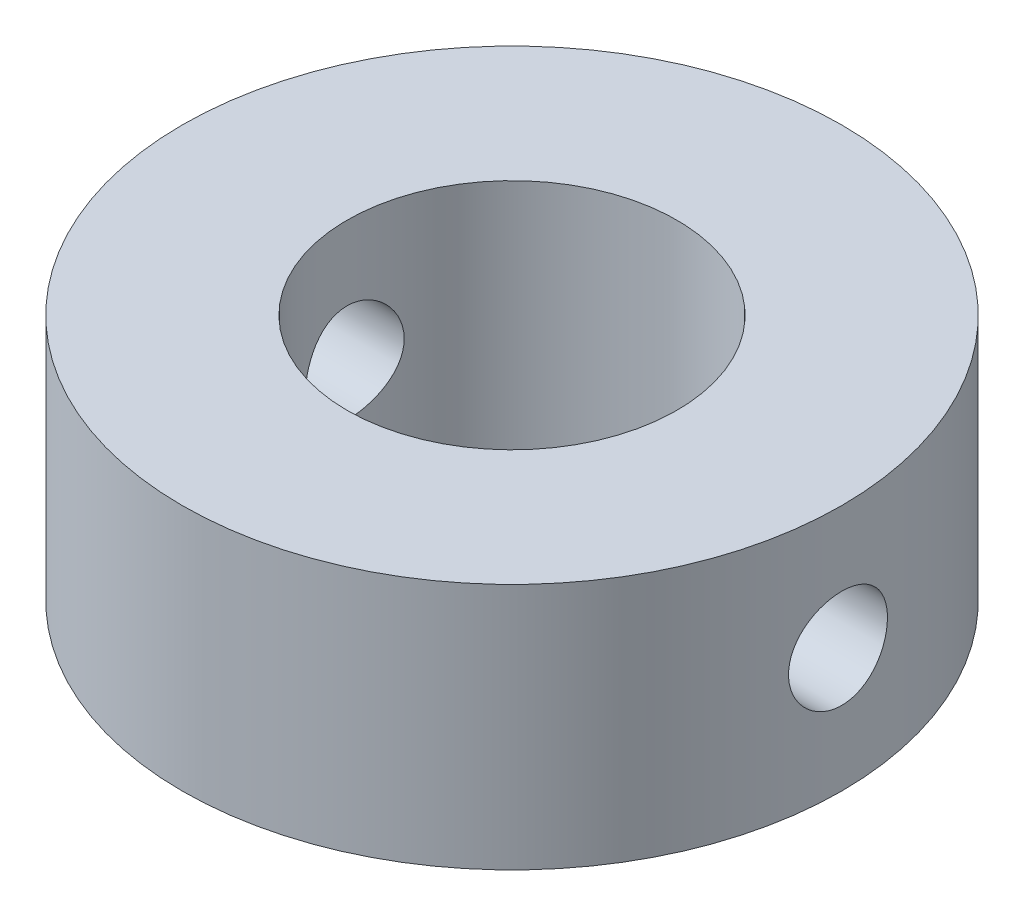
ISO-10303-21;
HEADER;
FILE_DESCRIPTION(('STEP AP214'),'2;1');
FILE_NAME('part.step','',(''),(''),'','','');
FILE_SCHEMA(('AUTOMOTIVE_DESIGN { 1 0 10303 214 1 1 1 1 }'));
ENDSEC;
DATA;
#1=APPLICATION_CONTEXT('core data for automotive mechanical design processes');
#2=APPLICATION_PROTOCOL_DEFINITION('international standard','automotive_design',2000,#1);
#3=PRODUCT_CONTEXT('',#1,'mechanical');
#4=PRODUCT('Part','Part','',(#3));
#5=PRODUCT_RELATED_PRODUCT_CATEGORY('part','',(#4));
#6=PRODUCT_DEFINITION_FORMATION('','',#4);
#7=PRODUCT_DEFINITION_CONTEXT('part definition',#1,'design');
#8=PRODUCT_DEFINITION('design','',#6,#7);
#9=PRODUCT_DEFINITION_SHAPE('','',#8);
#10=(LENGTH_UNIT() NAMED_UNIT(*) SI_UNIT(.MILLI.,.METRE.));
#11=(NAMED_UNIT(*) PLANE_ANGLE_UNIT() SI_UNIT($,.RADIAN.));
#12=(NAMED_UNIT(*) SI_UNIT($,.STERADIAN.) SOLID_ANGLE_UNIT());
#13=UNCERTAINTY_MEASURE_WITH_UNIT(LENGTH_MEASURE(1.E-05),#10,'distance_accuracy_value','');
#14=(GEOMETRIC_REPRESENTATION_CONTEXT(3) GLOBAL_UNCERTAINTY_ASSIGNED_CONTEXT((#13)) GLOBAL_UNIT_ASSIGNED_CONTEXT((#10,
#11,#12)) REPRESENTATION_CONTEXT('',''));
#15=CARTESIAN_POINT('',(0.,0.,0.));
#16=DIRECTION('',(0.,0.,1.));
#17=DIRECTION('',(1.,0.,0.));
#18=AXIS2_PLACEMENT_3D('',#15,#16,#17);
#19=CARTESIAN_POINT('',(0.,7.5,0.));
#20=DIRECTION('',(0.,1.,0.));
#21=DIRECTION('',(0.,0.,1.));
#22=AXIS2_PLACEMENT_3D('',#19,#20,#21);
#23=PLANE('',#22);
#24=CARTESIAN_POINT('',(0.,7.5,0.));
#25=DIRECTION('',(0.,1.,0.));
#26=DIRECTION('',(0.,0.,1.));
#27=AXIS2_PLACEMENT_3D('',#24,#25,#26);
#28=CIRCLE('',#27,10.);
#29=CARTESIAN_POINT('',(0.,7.5,10.));
#30=VERTEX_POINT('',#29);
#31=EDGE_CURVE('E10',#30,#30,#28,.T.);
#32=ORIENTED_EDGE('',*,*,#31,.T.);
#33=EDGE_LOOP('',(#32));
#34=FACE_BOUND('',#33,.T.);
#35=CARTESIAN_POINT('',(0.,7.5,0.));
#36=DIRECTION('',(0.,1.,0.));
#37=DIRECTION('',(0.,0.,1.));
#38=AXIS2_PLACEMENT_3D('',#35,#36,#37);
#39=CIRCLE('',#38,5.);
#40=CARTESIAN_POINT('',(0.,7.5,5.));
#41=VERTEX_POINT('',#40);
#42=EDGE_CURVE('E48',#41,#41,#39,.T.);
#43=ORIENTED_EDGE('',*,*,#42,.F.);
#44=EDGE_LOOP('',(#43));
#45=FACE_BOUND('',#44,.T.);
#46=ADVANCED_FACE('F30',(#34,#45),#23,.T.);
#47=CARTESIAN_POINT('',(0.,0.,0.));
#48=DIRECTION('',(0.,1.,0.));
#49=DIRECTION('',(0.,0.,1.));
#50=AXIS2_PLACEMENT_3D('',#47,#48,#49);
#51=PLANE('',#50);
#52=CARTESIAN_POINT('',(0.,0.,0.));
#53=DIRECTION('',(0.,1.,0.));
#54=DIRECTION('',(0.,0.,1.));
#55=AXIS2_PLACEMENT_3D('',#52,#53,#54);
#56=CIRCLE('',#55,10.);
#57=CARTESIAN_POINT('',(0.,0.,10.));
#58=VERTEX_POINT('',#57);
#59=EDGE_CURVE('E43',#58,#58,#56,.T.);
#60=ORIENTED_EDGE('',*,*,#59,.F.);
#61=EDGE_LOOP('',(#60));
#62=FACE_BOUND('',#61,.T.);
#63=CARTESIAN_POINT('',(0.,0.,0.));
#64=DIRECTION('',(0.,1.,0.));
#65=DIRECTION('',(0.,0.,1.));
#66=AXIS2_PLACEMENT_3D('',#63,#64,#65);
#67=CIRCLE('',#66,5.);
#68=CARTESIAN_POINT('',(0.,0.,5.));
#69=VERTEX_POINT('',#68);
#70=EDGE_CURVE('E51',#69,#69,#67,.T.);
#71=ORIENTED_EDGE('',*,*,#70,.T.);
#72=EDGE_LOOP('',(#71));
#73=FACE_BOUND('',#72,.T.);
#74=ADVANCED_FACE('F84',(#62,#73),#51,.F.);
#75=CARTESIAN_POINT('',(0.,7.5,0.));
#76=DIRECTION('',(0.,-1.,0.));
#77=DIRECTION('',(0.,0.,-1.));
#78=AXIS2_PLACEMENT_3D('',#75,#76,#77);
#79=CYLINDRICAL_SURFACE('',#78,10.);
#80=CARTESIAN_POINT('',(-9.88685996664259,3.75,-1.5));
#81=CARTESIAN_POINT('',(-9.88686136668593,3.83374556928995,-1.49999654107284));
#82=CARTESIAN_POINT('',(-9.88793551739101,3.91753975075071,-1.49296296388491));
#83=CARTESIAN_POINT('',(-9.8921131480324,4.08278531488313,-1.46502196657001));
#84=CARTESIAN_POINT('',(-9.8952186073143,4.16423433148001,-1.44410101402628));
#85=CARTESIAN_POINT('',(-9.90309938986228,4.3223737554469,-1.38902526098084));
#86=CARTESIAN_POINT('',(-9.90787343131536,4.39906776254216,-1.35488061681397));
#87=CARTESIAN_POINT('',(-9.91855194113145,4.54562703077208,-1.27435063087791));
#88=CARTESIAN_POINT('',(-9.92445625383668,4.6154932302143,-1.22796697429872));
#89=CARTESIAN_POINT('',(-9.9367828924804,4.74698381675433,-1.12387902418558));
#90=CARTESIAN_POINT('',(-9.94320862458057,4.80854561340674,-1.0660960558482));
#91=CARTESIAN_POINT('',(-9.95582368169047,4.9211374856555,-0.941019605444374));
#92=CARTESIAN_POINT('',(-9.96201299368615,4.97216698216699,-0.873725600786529));
#93=CARTESIAN_POINT('',(-9.97349347428185,5.06247663169136,-0.731136358052745));
#94=CARTESIAN_POINT('',(-9.97878018435569,5.10169915032246,-0.655804227365766));
#95=CARTESIAN_POINT('',(-9.98782206746405,5.16691159880818,-0.499528850106974));
#96=CARTESIAN_POINT('',(-9.99157732141945,5.19290222784289,-0.418585900270677));
#97=CARTESIAN_POINT('',(-9.99710914797782,5.23072338853084,-0.254031123090569));
#98=CARTESIAN_POINT('',(-9.99890035887344,5.24265872638717,-0.170443884389866));
#99=CARTESIAN_POINT('',(-10.0003524476958,5.2523559348249,-0.0024352040194791));
#100=CARTESIAN_POINT('',(-10.0000134440494,5.25011859331969,0.0819861910157462));
#101=CARTESIAN_POINT('',(-9.99725499660796,5.23161666223757,0.24855171820052));
#102=CARTESIAN_POINT('',(-9.99485227652479,5.21546482820852,0.330708691400008));
#103=CARTESIAN_POINT('',(-9.98825500227851,5.16976939367743,0.491132829143138));
#104=CARTESIAN_POINT('',(-9.98406040199739,5.14022544849856,0.569399893513481));
#105=CARTESIAN_POINT('',(-9.97432193873206,5.06846900308291,0.720163780770317));
#106=CARTESIAN_POINT('',(-9.96877303515638,5.02620903489126,0.792637672323597));
#107=CARTESIAN_POINT('',(-9.95694438245421,4.93025480633001,0.929507907150178));
#108=CARTESIAN_POINT('',(-9.95066458523184,4.87655979329313,0.993903718271736));
#109=CARTESIAN_POINT('',(-9.93800158192627,4.75863155117341,1.11345448272265));
#110=CARTESIAN_POINT('',(-9.93161796623257,4.69429987802989,1.16851232950947));
#111=CARTESIAN_POINT('',(-9.91952704453523,4.55725892287627,1.26706599338813));
#112=CARTESIAN_POINT('',(-9.91381974269649,4.48454958928008,1.31056173927999));
#113=CARTESIAN_POINT('',(-9.90372775286855,4.33271603705936,1.38476964534605));
#114=CARTESIAN_POINT('',(-9.89934409845291,4.25358686633761,1.41547182270082));
#115=CARTESIAN_POINT('',(-9.89241402899059,4.09121474485261,1.46312336208879));
#116=CARTESIAN_POINT('',(-9.88986748446299,4.00797208445325,1.48007369337326));
#117=CARTESIAN_POINT('',(-9.88692451395027,3.84059991042251,1.49960720086655));
#118=CARTESIAN_POINT('',(-9.88650748802574,3.75648681179847,1.50232803265052));
#119=CARTESIAN_POINT('',(-9.88781607937153,3.58900580518266,1.49369057019819));
#120=CARTESIAN_POINT('',(-9.88954163015778,3.50563787414924,1.48233271282302));
#121=CARTESIAN_POINT('',(-9.89492202461453,3.34244018203437,1.44597702952766));
#122=CARTESIAN_POINT('',(-9.89856716482858,3.2625947950584,1.42104778527821));
#123=CARTESIAN_POINT('',(-9.90736801825768,3.10821590795139,1.35832831947087));
#124=CARTESIAN_POINT('',(-9.91252380607176,3.0336826703718,1.32053746276389));
#125=CARTESIAN_POINT('',(-9.92381355687063,2.89142673966496,1.23283677995324));
#126=CARTESIAN_POINT('',(-9.92995459279988,2.82375955272018,1.18283784561766));
#127=CARTESIAN_POINT('',(-9.94250159433355,2.69772714012619,1.07226416837201));
#128=CARTESIAN_POINT('',(-9.94890757490292,2.63936244081885,1.0116888274468));
#129=CARTESIAN_POINT('',(-9.96132705217386,2.53309739336642,0.881075619628184));
#130=CARTESIAN_POINT('',(-9.96733683460423,2.48528827175752,0.810963126771957));
#131=CARTESIAN_POINT('',(-9.97822905032016,2.40212709473736,0.663622080263681));
#132=CARTESIAN_POINT('',(-9.98311151444563,2.36677469853497,0.586393721360439));
#133=CARTESIAN_POINT('',(-9.99118269660795,2.30967625751197,0.427297995861147));
#134=CARTESIAN_POINT('',(-9.99437761717899,2.28788033292164,0.345448858754302));
#135=CARTESIAN_POINT('',(-9.99873976656896,2.25835212046253,0.179200815501193));
#136=CARTESIAN_POINT('',(-9.99990712930801,2.25061890375086,0.0948020781305811));
#137=CARTESIAN_POINT('',(-10.0000812905914,2.2494582954506,-0.0732645908608183));
#138=CARTESIAN_POINT('',(-9.99910917023796,2.25589131912302,-0.156931570212052));
#139=CARTESIAN_POINT('',(-9.99515610519141,2.28258138842076,-0.321979795323107));
#140=CARTESIAN_POINT('',(-9.99217516692666,2.30283838980856,-0.403361048396512));
#141=CARTESIAN_POINT('',(-9.98453786742463,2.35655187557024,-0.561489374379661));
#142=CARTESIAN_POINT('',(-9.97988273316947,2.38999869513893,-0.638239793148783));
#143=CARTESIAN_POINT('',(-9.96940834495499,2.46912748798314,-0.785061117896603));
#144=CARTESIAN_POINT('',(-9.96358905320338,2.51480985848034,-0.855131806920709));
#145=CARTESIAN_POINT('',(-9.95136510636178,2.61761769882917,-0.987312585191959));
#146=CARTESIAN_POINT('',(-9.94495548425942,2.67484622581634,-1.04934206644638));
#147=CARTESIAN_POINT('',(-9.93231001689001,2.79890507308047,-1.16296808390268));
#148=CARTESIAN_POINT('',(-9.92607421276291,2.86573764382435,-1.21456216798984));
#149=CARTESIAN_POINT('',(-9.91444484029116,3.00754898323253,-1.30611310822974));
#150=CARTESIAN_POINT('',(-9.90905620156985,3.08257141702183,-1.34600294291209));
#151=CARTESIAN_POINT('',(-9.89978909110724,3.2382967767633,-1.41255613872045));
#152=CARTESIAN_POINT('',(-9.89590905307931,3.31899370785782,-1.43923322574898));
#153=CARTESIAN_POINT('',(-9.89099485524825,3.45837743625648,-1.47254951890026));
#154=CARTESIAN_POINT('',(-9.88945249382379,3.51620339692427,-1.4828276978042));
#155=CARTESIAN_POINT('',(-9.88738456567011,3.63267829173435,-1.49655410576574));
#156=CARTESIAN_POINT('',(-9.88685898576155,3.69132721519961,-1.50000242335076));
#157=CARTESIAN_POINT('',(-9.88685996664259,3.75,-1.5));
#158=B_SPLINE_CURVE_WITH_KNOTS('',3,(#80,#81,#82,#83,#84,#85,#86,#87,#88,#89,#90,#91,#92,#93,
#94,#95,#96,#97,#98,#99,#100,#101,#102,#103,#104,#105,#106,#107,#108,#109,#110,#111,#112,#113,
#114,#115,#116,#117,#118,#119,#120,#121,#122,#123,#124,#125,#126,#127,#128,#129,#130,#131,#132,
#133,#134,#135,#136,#137,#138,#139,#140,#141,#142,#143,#144,#145,#146,#147,#148,#149,#150,#151,
#152,#153,#154,#155,#156,#157),.UNSPECIFIED.,.T.,.F.,(4,2,2,2,2,2,2,2,2,2,2,2,2,2,2,2,2,2,2,2,2,
2,2,2,2,2,2,2,2,2,2,2,2,2,2,2,2,2,4),(0.,0.251022251804868,0.502289469561802,0.753364085335675,
1.00440414866133,1.25724158649107,1.51009292207817,1.76415922105782,2.01821209364501,
2.27035832534397,2.52249053939374,2.77259862515728,3.02271314839401,3.27377316386454,
3.52484970949272,3.77839544666269,4.0319427451435,4.28568751773139,4.53941440444341,
4.79068214603744,5.04194209099918,5.29194394807374,5.54195815286117,5.79385486001302,
6.04576581461802,6.29977537753516,6.55377799071854,6.8068404089109,7.05988611170473,
7.31044963622327,7.56101235892823,7.81139182257833,8.06177941567107,8.31450950010969,
8.56729890236862,8.82150878824931,9.07545403445564,9.25132441891613,9.42719252376192),.UNSPECIFIED.);
#159=CARTESIAN_POINT('',(-9.88685996664259,3.75,-1.5));
#160=VERTEX_POINT('',#159);
#161=EDGE_CURVE('E74',#160,#160,#158,.T.);
#162=ORIENTED_EDGE('',*,*,#161,.T.);
#163=EDGE_LOOP('',(#162));
#164=FACE_BOUND('',#163,.T.);
#165=CARTESIAN_POINT('',(9.88685996664259,3.75,-1.5));
#166=CARTESIAN_POINT('',(9.88686136668593,3.66625443071005,-1.49999654107284));
#167=CARTESIAN_POINT('',(9.88793551739101,3.58246024924929,-1.49296296388491));
#168=CARTESIAN_POINT('',(9.8921131480324,3.41721468511687,-1.46502196657001));
#169=CARTESIAN_POINT('',(9.8952186073143,3.33576566851999,-1.44410101402628));
#170=CARTESIAN_POINT('',(9.90309938986228,3.1776262445531,-1.38902526098084));
#171=CARTESIAN_POINT('',(9.90787343131536,3.10093223745784,-1.35488061681397));
#172=CARTESIAN_POINT('',(9.91855194113145,2.95437296922792,-1.27435063087791));
#173=CARTESIAN_POINT('',(9.92445625383668,2.8845067697857,-1.22796697429872));
#174=CARTESIAN_POINT('',(9.9367828924804,2.75301618324567,-1.12387902418558));
#175=CARTESIAN_POINT('',(9.94320862458057,2.69145438659326,-1.0660960558482));
#176=CARTESIAN_POINT('',(9.95582368169047,2.5788625143445,-0.941019605444374));
#177=CARTESIAN_POINT('',(9.96201299368615,2.52783301783301,-0.87372560078653));
#178=CARTESIAN_POINT('',(9.97349347428185,2.43752336830864,-0.731136358052746));
#179=CARTESIAN_POINT('',(9.97878018435569,2.39830084967754,-0.655804227365768));
#180=CARTESIAN_POINT('',(9.98782206746405,2.33308840119182,-0.499528850106975));
#181=CARTESIAN_POINT('',(9.99157732141945,2.30709777215711,-0.418585900270678));
#182=CARTESIAN_POINT('',(9.99710914797782,2.26927661146916,-0.25403112309057));
#183=CARTESIAN_POINT('',(9.99890035887344,2.25734127361284,-0.170443884389867));
#184=CARTESIAN_POINT('',(10.0003524476958,2.2476440651751,-0.0024352040194794));
#185=CARTESIAN_POINT('',(10.0000134440494,2.24988140668031,0.0819861910157459));
#186=CARTESIAN_POINT('',(9.99725499660796,2.26838333776243,0.248551718200519));
#187=CARTESIAN_POINT('',(9.99485227652479,2.28453517179148,0.330708691400007));
#188=CARTESIAN_POINT('',(9.98825500227851,2.33023060632257,0.491132829143137));
#189=CARTESIAN_POINT('',(9.98406040199739,2.35977455150144,0.569399893513481));
#190=CARTESIAN_POINT('',(9.97432193873206,2.43153099691709,0.720163780770316));
#191=CARTESIAN_POINT('',(9.96877303515638,2.47379096510874,0.792637672323596));
#192=CARTESIAN_POINT('',(9.95694438245421,2.56974519366999,0.929507907150177));
#193=CARTESIAN_POINT('',(9.95066458523184,2.62344020670686,0.993903718271735));
#194=CARTESIAN_POINT('',(9.93800158192627,2.74136844882659,1.11345448272265));
#195=CARTESIAN_POINT('',(9.93161796623257,2.80570012197011,1.16851232950947));
#196=CARTESIAN_POINT('',(9.91952704453523,2.94274107712373,1.26706599338813));
#197=CARTESIAN_POINT('',(9.91381974269649,3.01545041071992,1.31056173927999));
#198=CARTESIAN_POINT('',(9.90372775286855,3.16728396294064,1.38476964534605));
#199=CARTESIAN_POINT('',(9.89934409845291,3.24641313366239,1.41547182270082));
#200=CARTESIAN_POINT('',(9.89241402899059,3.40878525514739,1.46312336208879));
#201=CARTESIAN_POINT('',(9.88986748446299,3.49202791554675,1.48007369337326));
#202=CARTESIAN_POINT('',(9.88692451395027,3.65940008957749,1.49960720086655));
#203=CARTESIAN_POINT('',(9.88650748802574,3.74351318820153,1.50232803265052));
#204=CARTESIAN_POINT('',(9.88781607937153,3.91099419481734,1.49369057019819));
#205=CARTESIAN_POINT('',(9.88954163015778,3.99436212585076,1.48233271282302));
#206=CARTESIAN_POINT('',(9.89492202461453,4.15755981796563,1.44597702952766));
#207=CARTESIAN_POINT('',(9.89856716482858,4.2374052049416,1.42104778527821));
#208=CARTESIAN_POINT('',(9.90736801825768,4.39178409204861,1.35832831947087));
#209=CARTESIAN_POINT('',(9.91252380607176,4.4663173296282,1.32053746276389));
#210=CARTESIAN_POINT('',(9.92381355687063,4.60857326033504,1.23283677995324));
#211=CARTESIAN_POINT('',(9.92995459279988,4.67624044727982,1.18283784561766));
#212=CARTESIAN_POINT('',(9.94250159433355,4.80227285987381,1.07226416837201));
#213=CARTESIAN_POINT('',(9.94890757490292,4.86063755918115,1.0116888274468));
#214=CARTESIAN_POINT('',(9.96132705217386,4.96690260663358,0.881075619628184));
#215=CARTESIAN_POINT('',(9.96733683460423,5.01471172824248,0.810963126771958));
#216=CARTESIAN_POINT('',(9.97822905032016,5.09787290526264,0.663622080263682));
#217=CARTESIAN_POINT('',(9.98311151444563,5.13322530146503,0.586393721360439));
#218=CARTESIAN_POINT('',(9.99118269660795,5.19032374248803,0.427297995861147));
#219=CARTESIAN_POINT('',(9.99437761717899,5.21211966707836,0.345448858754303));
#220=CARTESIAN_POINT('',(9.99873976656896,5.24164787953747,0.179200815501194));
#221=CARTESIAN_POINT('',(9.99990712930801,5.24938109624914,0.0948020781305815));
#222=CARTESIAN_POINT('',(10.0000812905914,5.2505417045494,-0.0732645908608177));
#223=CARTESIAN_POINT('',(9.99910917023796,5.24410868087698,-0.156931570212051));
#224=CARTESIAN_POINT('',(9.99515610519141,5.21741861157924,-0.321979795323106));
#225=CARTESIAN_POINT('',(9.99217516692666,5.19716161019144,-0.403361048396512));
#226=CARTESIAN_POINT('',(9.98453786742463,5.14344812442976,-0.561489374379661));
#227=CARTESIAN_POINT('',(9.97988273316947,5.11000130486107,-0.638239793148782));
#228=CARTESIAN_POINT('',(9.96940834495499,5.03087251201686,-0.785061117896602));
#229=CARTESIAN_POINT('',(9.96358905320338,4.98519014151966,-0.855131806920709));
#230=CARTESIAN_POINT('',(9.95136510636178,4.88238230117083,-0.987312585191959));
#231=CARTESIAN_POINT('',(9.94495548425942,4.82515377418366,-1.04934206644638));
#232=CARTESIAN_POINT('',(9.93231001689001,4.70109492691953,-1.16296808390268));
#233=CARTESIAN_POINT('',(9.92607421276291,4.63426235617565,-1.21456216798984));
#234=CARTESIAN_POINT('',(9.91444484029116,4.49245101676747,-1.30611310822974));
#235=CARTESIAN_POINT('',(9.90905620156985,4.41742858297817,-1.34600294291209));
#236=CARTESIAN_POINT('',(9.89978909110724,4.2617032232367,-1.41255613872045));
#237=CARTESIAN_POINT('',(9.89590905307931,4.18100629214218,-1.43923322574898));
#238=CARTESIAN_POINT('',(9.89099485524825,4.04162256374352,-1.47254951890026));
#239=CARTESIAN_POINT('',(9.88945249382379,3.98379660307573,-1.4828276978042));
#240=CARTESIAN_POINT('',(9.88738456567011,3.86732170826565,-1.49655410576574));
#241=CARTESIAN_POINT('',(9.88685898576155,3.80867278480039,-1.50000242335076));
#242=CARTESIAN_POINT('',(9.88685996664259,3.75,-1.5));
#243=B_SPLINE_CURVE_WITH_KNOTS('',3,(#165,#166,#167,#168,#169,#170,#171,#172,#173,#174,#175,
#176,#177,#178,#179,#180,#181,#182,#183,#184,#185,#186,#187,#188,#189,#190,#191,#192,#193,#194,
#195,#196,#197,#198,#199,#200,#201,#202,#203,#204,#205,#206,#207,#208,#209,#210,#211,#212,#213,
#214,#215,#216,#217,#218,#219,#220,#221,#222,#223,#224,#225,#226,#227,#228,#229,#230,#231,#232,
#233,#234,#235,#236,#237,#238,#239,#240,#241,#242),.UNSPECIFIED.,.T.,.F.,(4,2,2,2,2,2,2,2,2,2,2,
2,2,2,2,2,2,2,2,2,2,2,2,2,2,2,2,2,2,2,2,2,2,2,2,2,2,2,4),(0.,0.251022251804868,
0.502289469561802,0.753364085335674,1.00440414866132,1.25724158649107,1.51009292207817,
1.76415922105782,2.01821209364501,2.27035832534397,2.52249053939374,2.77259862515728,
3.02271314839401,3.27377316386453,3.52484970949272,3.77839544666269,4.0319427451435,
4.28568751773139,4.53941440444341,4.79068214603744,5.04194209099918,5.29194394807374,
5.54195815286117,5.79385486001302,6.04576581461802,6.29977537753516,6.55377799071854,
6.8068404089109,7.05988611170473,7.31044963622327,7.56101235892823,7.81139182257833,
8.06177941567107,8.31450950010969,8.56729890236862,8.82150878824931,9.07545403445564,
9.25132441891613,9.42719252376192),.UNSPECIFIED.);
#244=CARTESIAN_POINT('',(9.88685996664259,3.75,-1.5));
#245=VERTEX_POINT('',#244);
#246=EDGE_CURVE('E70',#245,#245,#243,.T.);
#247=ORIENTED_EDGE('',*,*,#246,.T.);
#248=EDGE_LOOP('',(#247));
#249=FACE_BOUND('',#248,.T.);
#250=ORIENTED_EDGE('',*,*,#31,.F.);
#251=EDGE_LOOP('',(#250));
#252=FACE_BOUND('',#251,.T.);
#253=ORIENTED_EDGE('',*,*,#59,.T.);
#254=EDGE_LOOP('',(#253));
#255=FACE_BOUND('',#254,.T.);
#256=ADVANCED_FACE('F32',(#164,#249,#252,#255),#79,.T.);
#257=CARTESIAN_POINT('',(0.,7.5,0.));
#258=DIRECTION('',(0.,-1.,0.));
#259=DIRECTION('',(0.,0.,-1.));
#260=AXIS2_PLACEMENT_3D('',#257,#258,#259);
#261=CYLINDRICAL_SURFACE('',#260,5.);
#262=CARTESIAN_POINT('',(-4.76969600708473,3.75,-1.5));
#263=CARTESIAN_POINT('',(-4.7696968572698,3.8321945479424,-1.49999897633764));
#264=CARTESIAN_POINT('',(-4.77184390209069,3.91439922414402,-1.49322108167142));
#265=CARTESIAN_POINT('',(-4.780165783029,4.07640524959194,-1.46635844446749));
#266=CARTESIAN_POINT('',(-4.78634196493468,4.15620578650147,-1.44626925573578));
#267=CARTESIAN_POINT('',(-4.80196102485633,4.31103472827173,-1.39352753269955));
#268=CARTESIAN_POINT('',(-4.81139846703232,4.38607082963309,-1.36089589394243));
#269=CARTESIAN_POINT('',(-4.83246932547567,4.5296219339953,-1.28406421917929));
#270=CARTESIAN_POINT('',(-4.8441030704102,4.59813595868444,-1.23986245137053));
#271=CARTESIAN_POINT('',(-4.86866862185766,4.72886639057738,-1.13964754141627));
#272=CARTESIAN_POINT('',(-4.88162808311636,4.79084589794629,-1.08333207175807));
#273=CARTESIAN_POINT('',(-4.90714861936757,4.90463795132251,-0.961136237579598));
#274=CARTESIAN_POINT('',(-4.91970964297705,4.95644919044988,-0.895254645461111));
#275=CARTESIAN_POINT('',(-4.94333214579389,5.04946269983331,-0.754111437793689));
#276=CARTESIAN_POINT('',(-4.95435724342404,5.09042342444281,-0.678684021335814));
#277=CARTESIAN_POINT('',(-4.97334435920684,5.15898725904276,-0.521624645369353));
#278=CARTESIAN_POINT('',(-4.98130703789496,5.18659324985745,-0.43999402838791));
#279=CARTESIAN_POINT('',(-4.9930764600359,5.22688000109051,-0.275323852630828));
#280=CARTESIAN_POINT('',(-4.99699557369339,5.2399651276527,-0.1923913989538));
#281=CARTESIAN_POINT('',(-5.00063201501348,5.25211732464644,-0.0254218237493137));
#282=CARTESIAN_POINT('',(-5.00035022521079,5.25118733940196,0.0586150620503696));
#283=CARTESIAN_POINT('',(-4.99569603817659,5.23560713145698,0.222571156600161));
#284=CARTESIAN_POINT('',(-4.9914542020526,5.22139480619013,0.302536267641343));
#285=CARTESIAN_POINT('',(-4.97951522112593,5.18036866400571,0.458889213442528));
#286=CARTESIAN_POINT('',(-4.97181785750586,5.15355404905733,0.535276821322847));
#287=CARTESIAN_POINT('',(-4.95365220986963,5.08778797658144,0.683347326351282));
#288=CARTESIAN_POINT('',(-4.94315269676706,5.04869879719273,0.754965064694479));
#289=CARTESIAN_POINT('',(-4.92049640648069,4.95960214757177,0.890764673783157));
#290=CARTESIAN_POINT('',(-4.90833923637778,4.90959208703651,0.954944774872132));
#291=CARTESIAN_POINT('',(-4.88311550488166,4.7978022492484,1.0766604815298));
#292=CARTESIAN_POINT('',(-4.87003195321461,4.73564308097026,1.13384458040112));
#293=CARTESIAN_POINT('',(-4.84483979887497,4.60248998210995,1.23707651539824));
#294=CARTESIAN_POINT('',(-4.8327312931702,4.53149517461077,1.28312324482853));
#295=CARTESIAN_POINT('',(-4.81077903197678,4.38176053075101,1.3631399533545));
#296=CARTESIAN_POINT('',(-4.80095810695957,4.30295295413708,1.39698989237679));
#297=CARTESIAN_POINT('',(-4.78496392548436,4.14039279155445,1.45083362878413));
#298=CARTESIAN_POINT('',(-4.7787894791583,4.05664182846544,1.4708319464056));
#299=CARTESIAN_POINT('',(-4.77104849541242,3.88991763926072,1.49574770282165));
#300=CARTESIAN_POINT('',(-4.76931878670441,3.80703177610602,1.50119946380212));
#301=CARTESIAN_POINT('',(-4.77021192441924,3.64152709999013,1.49835947233062));
#302=CARTESIAN_POINT('',(-4.77283416156589,3.55890825126915,1.4900696437133));
#303=CARTESIAN_POINT('',(-4.78197558554912,3.39851162202913,1.4604576357419));
#304=CARTESIAN_POINT('',(-4.78839176507489,3.32066383573648,1.4394796143128));
#305=CARTESIAN_POINT('',(-4.80429141231227,3.16959830918508,1.3854857774794));
#306=CARTESIAN_POINT('',(-4.81377535359073,3.09638128585943,1.35246810342759));
#307=CARTESIAN_POINT('',(-4.83505835023047,2.95448253592787,1.274318711965));
#308=CARTESIAN_POINT('',(-4.84691271069799,2.88597527901421,1.22888564172729));
#309=CARTESIAN_POINT('',(-4.87148205646987,2.7573618938192,1.12755301600385));
#310=CARTESIAN_POINT('',(-4.88419724730003,2.69725778238721,1.07165095534896));
#311=CARTESIAN_POINT('',(-4.90963633548158,2.58481959418526,0.948455132493598));
#312=CARTESIAN_POINT('',(-4.92234245063004,2.53286437101302,0.880811065857433));
#313=CARTESIAN_POINT('',(-4.94584851748651,2.44103329897225,0.737461784590247));
#314=CARTESIAN_POINT('',(-4.95664856384717,2.40115685021854,0.661756970543942));
#315=CARTESIAN_POINT('',(-4.97505970474957,2.3349999694317,0.50493550470522));
#316=CARTESIAN_POINT('',(-4.98269453424966,2.30861798384102,0.423864622037837));
#317=CARTESIAN_POINT('',(-4.99401979596827,2.26993908110958,0.258169966504587));
#318=CARTESIAN_POINT('',(-4.9977113567088,2.25763813405158,0.173547217354761));
#319=CARTESIAN_POINT('',(-5.00066544081399,2.2477769559455,0.00665215388274135));
#320=CARTESIAN_POINT('',(-5.00009305111322,2.24966730459217,-0.0755851790862082));
#321=CARTESIAN_POINT('',(-4.99497264465037,2.26682163249912,-0.238519481164405));
#322=CARTESIAN_POINT('',(-4.99042485330463,2.28208485348044,-0.31921653734653));
#323=CARTESIAN_POINT('',(-4.97791168358327,2.32521166139962,-0.475935813041359));
#324=CARTESIAN_POINT('',(-4.96998352900866,2.35293818064901,-0.551998927351393));
#325=CARTESIAN_POINT('',(-4.9515294303945,2.42008191450719,-0.698433237752054));
#326=CARTESIAN_POINT('',(-4.94100305949946,2.45950105028619,-0.768803496050581));
#327=CARTESIAN_POINT('',(-4.91803965828228,2.55037345743004,-0.904301892420565));
#328=CARTESIAN_POINT('',(-4.90555226923559,2.60217143000077,-0.969190250076769));
#329=CARTESIAN_POINT('',(-4.88023537212334,2.7157103883328,-1.08953757134595));
#330=CARTESIAN_POINT('',(-4.86740576641079,2.77745423789815,-1.14499380960194));
#331=CARTESIAN_POINT('',(-4.84240680631319,2.91134077831051,-1.24656269394549));
#332=CARTESIAN_POINT('',(-4.83026852693485,2.98373855339044,-1.29234759757956));
#333=CARTESIAN_POINT('',(-4.80852547508793,3.13555517416102,-1.37104313528776));
#334=CARTESIAN_POINT('',(-4.79891948596956,3.2149706236012,-1.40395995557289));
#335=CARTESIAN_POINT('',(-4.78427816717595,3.36974043160628,-1.4530194253295));
#336=CARTESIAN_POINT('',(-4.7788615484052,3.44460864693099,-1.47058859011232));
#337=CARTESIAN_POINT('',(-4.77157042597167,3.59631522249577,-1.49407818835144));
#338=CARTESIAN_POINT('',(-4.76969521221431,3.67315318464525,-1.50000095706095));
#339=CARTESIAN_POINT('',(-4.76969600708473,3.75,-1.5));
#340=B_SPLINE_CURVE_WITH_KNOTS('',3,(#262,#263,#264,#265,#266,#267,#268,#269,#270,#271,#272,
#273,#274,#275,#276,#277,#278,#279,#280,#281,#282,#283,#284,#285,#286,#287,#288,#289,#290,#291,
#292,#293,#294,#295,#296,#297,#298,#299,#300,#301,#302,#303,#304,#305,#306,#307,#308,#309,#310,
#311,#312,#313,#314,#315,#316,#317,#318,#319,#320,#321,#322,#323,#324,#325,#326,#327,#328,#329,
#330,#331,#332,#333,#334,#335,#336,#337,#338,#339),.UNSPECIFIED.,.T.,.F.,(4,2,2,2,2,2,2,2,2,2,2,
2,2,2,2,2,2,2,2,2,2,2,2,2,2,2,2,2,2,2,2,2,2,2,2,2,2,2,4),(0.,0.246300165915543,
0.492682641689001,0.738656414466195,0.984667025370102,1.23773150007984,1.49082847871273,
1.74915939273645,2.00743455587877,2.25832140149558,2.5091555410144,2.7520012599088,
2.99486235890376,3.24055209335676,3.48630016590831,3.74152147023278,3.99676812491863,
4.25446238246267,4.51207250628411,4.76008080790309,5.00805439107388,5.24958594938817,
5.49115481045787,5.73920731809388,5.98731925928923,6.24479506100602,6.50225807324202,
6.75775391814325,7.01317662321682,7.2587630391122,7.50433553047755,7.74727096872219,
7.99024634491378,8.24099627054489,8.4918185262989,8.75011639669147,9.00828993963944,
9.23861153857448,9.4688869503356),.UNSPECIFIED.);
#341=CARTESIAN_POINT('',(-4.76969600708473,3.75,-1.5));
#342=VERTEX_POINT('',#341);
#343=EDGE_CURVE('E35',#342,#342,#340,.T.);
#344=ORIENTED_EDGE('',*,*,#343,.F.);
#345=EDGE_LOOP('',(#344));
#346=FACE_BOUND('',#345,.T.);
#347=CARTESIAN_POINT('',(4.76969600708473,3.75,-1.5));
#348=CARTESIAN_POINT('',(4.7696968572698,3.6678054520576,-1.49999897633764));
#349=CARTESIAN_POINT('',(4.77184390209069,3.58560077585597,-1.49322108167142));
#350=CARTESIAN_POINT('',(4.780165783029,3.42359475040806,-1.46635844446749));
#351=CARTESIAN_POINT('',(4.78634196493468,3.34379421349853,-1.44626925573578));
#352=CARTESIAN_POINT('',(4.80196102485633,3.18896527172827,-1.39352753269955));
#353=CARTESIAN_POINT('',(4.81139846703232,3.11392917036691,-1.36089589394243));
#354=CARTESIAN_POINT('',(4.83246932547567,2.9703780660047,-1.28406421917929));
#355=CARTESIAN_POINT('',(4.8441030704102,2.90186404131556,-1.23986245137053));
#356=CARTESIAN_POINT('',(4.86866862185766,2.77113360942262,-1.13964754141627));
#357=CARTESIAN_POINT('',(4.88162808311636,2.70915410205371,-1.08333207175807));
#358=CARTESIAN_POINT('',(4.90714861936757,2.59536204867749,-0.961136237579599));
#359=CARTESIAN_POINT('',(4.91970964297705,2.54355080955012,-0.895254645461111));
#360=CARTESIAN_POINT('',(4.94333214579389,2.45053730016669,-0.75411143779369));
#361=CARTESIAN_POINT('',(4.95435724342404,2.40957657555719,-0.678684021335814));
#362=CARTESIAN_POINT('',(4.97334435920684,2.34101274095724,-0.521624645369354));
#363=CARTESIAN_POINT('',(4.98130703789495,2.31340675014255,-0.439994028387912));
#364=CARTESIAN_POINT('',(4.99307646003589,2.27311999890949,-0.27532385263083));
#365=CARTESIAN_POINT('',(4.99699557369339,2.2600348723473,-0.192391398953801));
#366=CARTESIAN_POINT('',(5.00063201501348,2.24788267535356,-0.0254218237493151));
#367=CARTESIAN_POINT('',(5.00035022521079,2.24881266059804,0.0586150620503681));
#368=CARTESIAN_POINT('',(4.99569603817659,2.26439286854302,0.22257115660016));
#369=CARTESIAN_POINT('',(4.9914542020526,2.27860519380987,0.302536267641341));
#370=CARTESIAN_POINT('',(4.97951522112593,2.31963133599429,0.458889213442527));
#371=CARTESIAN_POINT('',(4.97181785750586,2.34644595094267,0.535276821322846));
#372=CARTESIAN_POINT('',(4.95365220986963,2.41221202341856,0.683347326351281));
#373=CARTESIAN_POINT('',(4.94315269676706,2.45130120280727,0.754965064694478));
#374=CARTESIAN_POINT('',(4.92049640648069,2.54039785242823,0.890764673783156));
#375=CARTESIAN_POINT('',(4.90833923637778,2.59040791296348,0.954944774872131));
#376=CARTESIAN_POINT('',(4.88311550488166,2.7021977507516,1.0766604815298));
#377=CARTESIAN_POINT('',(4.87003195321461,2.76435691902974,1.13384458040111));
#378=CARTESIAN_POINT('',(4.84483979887497,2.89751001789005,1.23707651539824));
#379=CARTESIAN_POINT('',(4.8327312931702,2.96850482538923,1.28312324482853));
#380=CARTESIAN_POINT('',(4.81077903197678,3.11823946924899,1.3631399533545));
#381=CARTESIAN_POINT('',(4.80095810695957,3.19704704586292,1.39698989237679));
#382=CARTESIAN_POINT('',(4.78496392548436,3.35960720844554,1.45083362878413));
#383=CARTESIAN_POINT('',(4.7787894791583,3.44335817153456,1.4708319464056));
#384=CARTESIAN_POINT('',(4.77104849541242,3.61008236073928,1.49574770282165));
#385=CARTESIAN_POINT('',(4.76931878670441,3.69296822389398,1.50119946380212));
#386=CARTESIAN_POINT('',(4.77021192441924,3.85847290000987,1.49835947233062));
#387=CARTESIAN_POINT('',(4.77283416156589,3.94109174873085,1.4900696437133));
#388=CARTESIAN_POINT('',(4.78197558554912,4.10148837797087,1.4604576357419));
#389=CARTESIAN_POINT('',(4.78839176507489,4.17933616426352,1.4394796143128));
#390=CARTESIAN_POINT('',(4.80429141231227,4.33040169081492,1.3854857774794));
#391=CARTESIAN_POINT('',(4.81377535359073,4.40361871414057,1.3524681034276));
#392=CARTESIAN_POINT('',(4.83505835023047,4.54551746407213,1.274318711965));
#393=CARTESIAN_POINT('',(4.84691271069799,4.61402472098579,1.22888564172729));
#394=CARTESIAN_POINT('',(4.87148205646987,4.7426381061808,1.12755301600385));
#395=CARTESIAN_POINT('',(4.88419724730003,4.80274221761279,1.07165095534897));
#396=CARTESIAN_POINT('',(4.90963633548158,4.91518040581474,0.948455132493599));
#397=CARTESIAN_POINT('',(4.92234245063004,4.96713562898698,0.880811065857435));
#398=CARTESIAN_POINT('',(4.94584851748651,5.05896670102775,0.737461784590249));
#399=CARTESIAN_POINT('',(4.95664856384717,5.09884314978146,0.661756970543944));
#400=CARTESIAN_POINT('',(4.97505970474957,5.1650000305683,0.504935504705221));
#401=CARTESIAN_POINT('',(4.98269453424966,5.19138201615897,0.423864622037839));
#402=CARTESIAN_POINT('',(4.99401979596827,5.23006091889042,0.258169966504588));
#403=CARTESIAN_POINT('',(4.9977113567088,5.24236186594842,0.173547217354763));
#404=CARTESIAN_POINT('',(5.00066544081399,5.2522230440545,0.0066521538827433));
#405=CARTESIAN_POINT('',(5.00009305111322,5.25033269540783,-0.0755851790862062));
#406=CARTESIAN_POINT('',(4.99497264465037,5.23317836750088,-0.238519481164404));
#407=CARTESIAN_POINT('',(4.99042485330463,5.21791514651956,-0.319216537346528));
#408=CARTESIAN_POINT('',(4.97791168358327,5.17478833860037,-0.475935813041358));
#409=CARTESIAN_POINT('',(4.96998352900866,5.14706181935099,-0.551998927351392));
#410=CARTESIAN_POINT('',(4.9515294303945,5.07991808549281,-0.698433237752053));
#411=CARTESIAN_POINT('',(4.94100305949946,5.04049894971381,-0.768803496050579));
#412=CARTESIAN_POINT('',(4.91803965828228,4.94962654256997,-0.904301892420563));
#413=CARTESIAN_POINT('',(4.90555226923559,4.89782856999923,-0.969190250076766));
#414=CARTESIAN_POINT('',(4.88023537212334,4.7842896116672,-1.08953757134594));
#415=CARTESIAN_POINT('',(4.86740576641079,4.72254576210185,-1.14499380960193));
#416=CARTESIAN_POINT('',(4.84240680631319,4.58865922168949,-1.24656269394549));
#417=CARTESIAN_POINT('',(4.83026852693485,4.51626144660956,-1.29234759757956));
#418=CARTESIAN_POINT('',(4.80852547508793,4.36444482583898,-1.37104313528776));
#419=CARTESIAN_POINT('',(4.79891948596956,4.2850293763988,-1.40395995557289));
#420=CARTESIAN_POINT('',(4.78427816717595,4.13025956839373,-1.4530194253295));
#421=CARTESIAN_POINT('',(4.7788615484052,4.05539135306901,-1.47058859011232));
#422=CARTESIAN_POINT('',(4.77157042597167,3.90368477750423,-1.49407818835144));
#423=CARTESIAN_POINT('',(4.76969521221431,3.82684681535475,-1.50000095706095));
#424=CARTESIAN_POINT('',(4.76969600708473,3.75,-1.5));
#425=B_SPLINE_CURVE_WITH_KNOTS('',3,(#347,#348,#349,#350,#351,#352,#353,#354,#355,#356,#357,
#358,#359,#360,#361,#362,#363,#364,#365,#366,#367,#368,#369,#370,#371,#372,#373,#374,#375,#376,
#377,#378,#379,#380,#381,#382,#383,#384,#385,#386,#387,#388,#389,#390,#391,#392,#393,#394,#395,
#396,#397,#398,#399,#400,#401,#402,#403,#404,#405,#406,#407,#408,#409,#410,#411,#412,#413,#414,
#415,#416,#417,#418,#419,#420,#421,#422,#423,#424),.UNSPECIFIED.,.T.,.F.,(4,2,2,2,2,2,2,2,2,2,2,
2,2,2,2,2,2,2,2,2,2,2,2,2,2,2,2,2,2,2,2,2,2,2,2,2,2,2,4),(0.,0.246300165915543,0.492682641689,
0.738656414466193,0.984667025370101,1.23773150007984,1.49082847871273,1.74915939273645,
2.00743455587877,2.25832140149558,2.5091555410144,2.7520012599088,2.99486235890376,
3.24055209335676,3.4863001659083,3.74152147023278,3.99676812491863,4.25446238246266,
4.51207250628411,4.76008080790309,5.00805439107388,5.24958594938817,5.49115481045787,
5.73920731809388,5.98731925928923,6.24479506100602,6.50225807324202,6.75775391814325,
7.01317662321682,7.2587630391122,7.50433553047755,7.74727096872219,7.99024634491378,
8.24099627054488,8.4918185262989,8.75011639669147,9.00828993963944,9.23861153857448,
9.4688869503356),.UNSPECIFIED.);
#426=CARTESIAN_POINT('',(4.76969600708473,3.75,-1.5));
#427=VERTEX_POINT('',#426);
#428=EDGE_CURVE('E53',#427,#427,#425,.T.);
#429=ORIENTED_EDGE('',*,*,#428,.F.);
#430=EDGE_LOOP('',(#429));
#431=FACE_BOUND('',#430,.T.);
#432=ORIENTED_EDGE('',*,*,#42,.T.);
#433=EDGE_LOOP('',(#432));
#434=FACE_BOUND('',#433,.T.);
#435=ORIENTED_EDGE('',*,*,#70,.F.);
#436=EDGE_LOOP('',(#435));
#437=FACE_BOUND('',#436,.T.);
#438=ADVANCED_FACE('F57',(#346,#431,#434,#437),#261,.F.);
#439=CARTESIAN_POINT('',(-19.,3.75,0.));
#440=DIRECTION('',(1.,0.,0.));
#441=DIRECTION('',(0.,0.,-1.));
#442=AXIS2_PLACEMENT_3D('',#439,#440,#441);
#443=CYLINDRICAL_SURFACE('',#442,1.5);
#444=ORIENTED_EDGE('',*,*,#428,.T.);
#445=EDGE_LOOP('',(#444));
#446=FACE_BOUND('',#445,.T.);
#447=ORIENTED_EDGE('',*,*,#246,.F.);
#448=EDGE_LOOP('',(#447));
#449=FACE_BOUND('',#448,.T.);
#450=ADVANCED_FACE('F63',(#446,#449),#443,.F.);
#451=ORIENTED_EDGE('',*,*,#343,.T.);
#452=EDGE_LOOP('',(#451));
#453=FACE_BOUND('',#452,.T.);
#454=ORIENTED_EDGE('',*,*,#161,.F.);
#455=EDGE_LOOP('',(#454));
#456=FACE_BOUND('',#455,.T.);
#457=ADVANCED_FACE('F60',(#453,#456),#443,.F.);
#458=CLOSED_SHELL('',(#46,#74,#256,#438,#450,#457));
#459=MANIFOLD_SOLID_BREP('B2',#458);
#460=ADVANCED_BREP_SHAPE_REPRESENTATION('',(#18,#459),#14);
#461=SHAPE_DEFINITION_REPRESENTATION(#9,#460);
ENDSEC;
END-ISO-10303-21;
